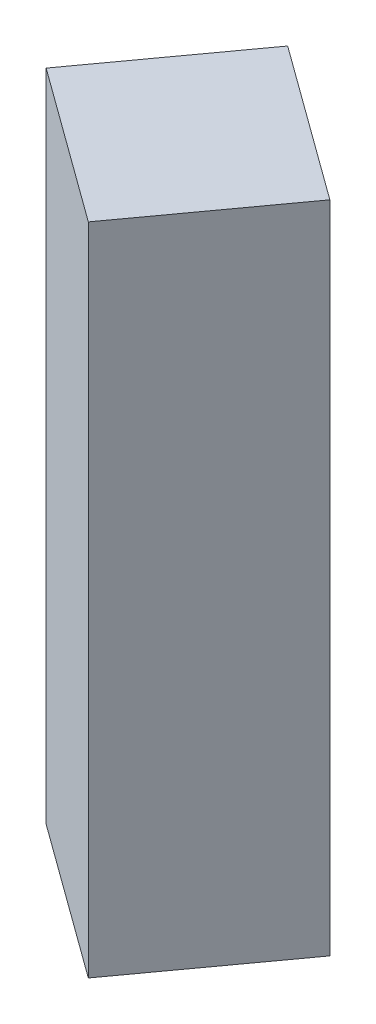
ISO-10303-21;
HEADER;
FILE_DESCRIPTION(('STEP AP214'),'2;1');
FILE_NAME('part.step','',(''),(''),'','','');
FILE_SCHEMA(('AUTOMOTIVE_DESIGN { 1 0 10303 214 1 1 1 1 }'));
ENDSEC;
DATA;
#1=APPLICATION_CONTEXT('core data for automotive mechanical design processes');
#2=APPLICATION_PROTOCOL_DEFINITION('international standard','automotive_design',2000,#1);
#3=PRODUCT_CONTEXT('',#1,'mechanical');
#4=PRODUCT('Part','Part','',(#3));
#5=PRODUCT_RELATED_PRODUCT_CATEGORY('part','',(#4));
#6=PRODUCT_DEFINITION_FORMATION('','',#4);
#7=PRODUCT_DEFINITION_CONTEXT('part definition',#1,'design');
#8=PRODUCT_DEFINITION('design','',#6,#7);
#9=PRODUCT_DEFINITION_SHAPE('','',#8);
#10=(LENGTH_UNIT() NAMED_UNIT(*) SI_UNIT(.MILLI.,.METRE.));
#11=(NAMED_UNIT(*) PLANE_ANGLE_UNIT() SI_UNIT($,.RADIAN.));
#12=(NAMED_UNIT(*) SI_UNIT($,.STERADIAN.) SOLID_ANGLE_UNIT());
#13=UNCERTAINTY_MEASURE_WITH_UNIT(LENGTH_MEASURE(1.E-05),#10,'distance_accuracy_value','');
#14=(GEOMETRIC_REPRESENTATION_CONTEXT(3) GLOBAL_UNCERTAINTY_ASSIGNED_CONTEXT((#13)) GLOBAL_UNIT_ASSIGNED_CONTEXT((#10,
#11,#12)) REPRESENTATION_CONTEXT('',''));
#15=CARTESIAN_POINT('',(0.,0.,0.));
#16=DIRECTION('',(0.,0.,1.));
#17=DIRECTION('',(1.,0.,0.));
#18=AXIS2_PLACEMENT_3D('',#15,#16,#17);
#19=CARTESIAN_POINT('',(97.2404196158,41.8789091554,79.586125689));
#20=DIRECTION('',(0.809016988906328,0.,0.587785259819381));
#21=DIRECTION('',(0.587785259819381,0.,-0.809016988906328));
#22=AXIS2_PLACEMENT_3D('',#19,#20,#21);
#23=PLANE('',#22);
#24=DIRECTION('',(-0.587785259819381,0.,0.809016988906329));
#25=VECTOR('',#24,1.);
#26=CARTESIAN_POINT('',(97.6255914896,46.8419278552,79.055982096));
#27=LINE('',#26,#25);
#28=CARTESIAN_POINT('',(98.0107633634,46.8419278552,78.525838503));
#29=VERTEX_POINT('',#28);
#30=CARTESIAN_POINT('',(97.2404196158,46.8419278552,79.586125689));
#31=VERTEX_POINT('',#30);
#32=EDGE_CURVE('E61',#29,#31,#27,.T.);
#33=ORIENTED_EDGE('',*,*,#32,.T.);
#34=DIRECTION('',(0.,1.,0.));
#35=VECTOR('',#34,1.);
#36=CARTESIAN_POINT('',(97.2404196158,44.3604185053,79.586125689));
#37=LINE('',#36,#35);
#38=CARTESIAN_POINT('',(97.2404196232103,41.8789091554,79.5861256991877));
#39=VERTEX_POINT('',#38);
#40=EDGE_CURVE('E81',#39,#31,#37,.T.);
#41=ORIENTED_EDGE('',*,*,#40,.F.);
#42=DIRECTION('',(0.587785259819381,0.,-0.809016988906329));
#43=VECTOR('',#42,1.);
#44=CARTESIAN_POINT('',(97.6255914896,41.8789091554,79.055982096));
#45=LINE('',#44,#43);
#46=CARTESIAN_POINT('',(98.0107633642956,41.8789091554,78.5258385069229));
#47=VERTEX_POINT('',#46);
#48=EDGE_CURVE('E84',#39,#47,#45,.T.);
#49=ORIENTED_EDGE('',*,*,#48,.T.);
#50=DIRECTION('',(0.,-1.,0.));
#51=VECTOR('',#50,1.);
#52=CARTESIAN_POINT('',(98.0107633634,44.3604185053,78.525838503));
#53=LINE('',#52,#51);
#54=EDGE_CURVE('E65',#29,#47,#53,.T.);
#55=ORIENTED_EDGE('',*,*,#54,.F.);
#56=EDGE_LOOP('',(#33,#41,#49,#55));
#57=FACE_BOUND('',#56,.T.);
#58=ADVANCED_FACE('F17',(#57),#23,.T.);
#59=CARTESIAN_POINT('',(96.0710590132,41.8789091554,78.7365354908));
#60=DIRECTION('',(-0.587785247690543,0.,0.809016997718445));
#61=DIRECTION('',(0.809016997718445,0.,0.587785247690543));
#62=AXIS2_PLACEMENT_3D('',#59,#60,#61);
#63=PLANE('',#62);
#64=DIRECTION('',(-0.809016997718445,0.,-0.587785247690543));
#65=VECTOR('',#64,1.);
#66=CARTESIAN_POINT('',(96.6557393145,46.8419278552,79.1613305899));
#67=LINE('',#66,#65);
#68=CARTESIAN_POINT('',(96.0710590132,46.8419278552,78.7365354908));
#69=VERTEX_POINT('',#68);
#70=EDGE_CURVE('E78',#31,#69,#67,.T.);
#71=ORIENTED_EDGE('',*,*,#70,.T.);
#72=DIRECTION('',(0.,1.,0.));
#73=VECTOR('',#72,1.);
#74=CARTESIAN_POINT('',(96.0710590132,44.3604185053,78.7365354908));
#75=LINE('',#74,#73);
#76=CARTESIAN_POINT('',(96.0710590103535,41.8789091554,78.7365354887319));
#77=VERTEX_POINT('',#76);
#78=EDGE_CURVE('E73',#77,#69,#75,.T.);
#79=ORIENTED_EDGE('',*,*,#78,.F.);
#80=DIRECTION('',(0.809016997718445,0.,0.587785247690543));
#81=VECTOR('',#80,1.);
#82=CARTESIAN_POINT('',(96.6557393145,41.8789091554,79.1613305899));
#83=LINE('',#82,#81);
#84=EDGE_CURVE('E31',#77,#39,#83,.T.);
#85=ORIENTED_EDGE('',*,*,#84,.T.);
#86=ORIENTED_EDGE('',*,*,#40,.T.);
#87=EDGE_LOOP('',(#71,#79,#85,#86));
#88=FACE_BOUND('',#87,.T.);
#89=ADVANCED_FACE('F89',(#88),#63,.T.);
#90=CARTESIAN_POINT('',(98.0107633634,46.8419278552,78.525838503));
#91=DIRECTION('',(0.,-1.,0.));
#92=DIRECTION('',(-0.587785259819381,0.,0.809016988906328));
#93=AXIS2_PLACEMENT_3D('',#90,#91,#92);
#94=PLANE('',#93);
#95=ORIENTED_EDGE('',*,*,#32,.F.);
#96=DIRECTION('',(0.809016995433336,0.,0.587785250835726));
#97=VECTOR('',#96,1.);
#98=CARTESIAN_POINT('',(97.4260830494,46.8419278552,78.1010433912));
#99=LINE('',#98,#97);
#100=CARTESIAN_POINT('',(96.8414027354,46.8419278552,77.6762482794));
#101=VERTEX_POINT('',#100);
#102=EDGE_CURVE('E54',#101,#29,#99,.T.);
#103=ORIENTED_EDGE('',*,*,#102,.F.);
#104=DIRECTION('',(0.587785237918549,0.,-0.809017004818214));
#105=VECTOR('',#104,1.);
#106=CARTESIAN_POINT('',(96.4562308743,46.8419278552,78.2063918851));
#107=LINE('',#106,#105);
#108=EDGE_CURVE('E59',#69,#101,#107,.T.);
#109=ORIENTED_EDGE('',*,*,#108,.F.);
#110=ORIENTED_EDGE('',*,*,#70,.F.);
#111=EDGE_LOOP('',(#95,#103,#109,#110));
#112=FACE_BOUND('',#111,.T.);
#113=ADVANCED_FACE('F56',(#112),#94,.F.);
#114=CARTESIAN_POINT('',(98.0107633634,41.8789091554,78.525838503));
#115=DIRECTION('',(0.587785250835726,0.,-0.809016995433336));
#116=DIRECTION('',(-0.809016995433336,0.,-0.587785250835726));
#117=AXIS2_PLACEMENT_3D('',#114,#115,#116);
#118=PLANE('',#117);
#119=ORIENTED_EDGE('',*,*,#102,.T.);
#120=ORIENTED_EDGE('',*,*,#54,.T.);
#121=DIRECTION('',(-0.809016995433336,0.,-0.587785250835726));
#122=VECTOR('',#121,1.);
#123=CARTESIAN_POINT('',(97.4260830494,41.8789091554,78.1010433912));
#124=LINE('',#123,#122);
#125=CARTESIAN_POINT('',(96.8414027400568,41.8789091554,77.6762482827834));
#126=VERTEX_POINT('',#125);
#127=EDGE_CURVE('E66',#47,#126,#124,.T.);
#128=ORIENTED_EDGE('',*,*,#127,.T.);
#129=DIRECTION('',(0.,-1.,0.));
#130=VECTOR('',#129,1.);
#131=CARTESIAN_POINT('',(96.8414027354,44.3604185053,77.6762482794));
#132=LINE('',#131,#130);
#133=EDGE_CURVE('E26',#101,#126,#132,.T.);
#134=ORIENTED_EDGE('',*,*,#133,.F.);
#135=EDGE_LOOP('',(#119,#120,#128,#134));
#136=FACE_BOUND('',#135,.T.);
#137=ADVANCED_FACE('F69',(#136),#118,.T.);
#138=CARTESIAN_POINT('',(96.8414027354,41.8789091554,77.6762482794));
#139=DIRECTION('',(-0.809017004818214,0.,-0.587785237918549));
#140=DIRECTION('',(-0.587785237918549,0.,0.809017004818214));
#141=AXIS2_PLACEMENT_3D('',#138,#139,#140);
#142=PLANE('',#141);
#143=ORIENTED_EDGE('',*,*,#108,.T.);
#144=ORIENTED_EDGE('',*,*,#133,.T.);
#145=DIRECTION('',(0.587785249368989,0.,-0.809016996498983));
#146=VECTOR('',#145,1.);
#147=CARTESIAN_POINT('',(96.071059010619,41.8789091554,78.7365354823803));
#148=LINE('',#147,#146);
#149=EDGE_CURVE('E11',#77,#126,#148,.T.);
#150=ORIENTED_EDGE('',*,*,#149,.F.);
#151=ORIENTED_EDGE('',*,*,#78,.T.);
#152=EDGE_LOOP('',(#143,#144,#150,#151));
#153=FACE_BOUND('',#152,.T.);
#154=ADVANCED_FACE('F72',(#153),#142,.T.);
#155=CARTESIAN_POINT('',(96.059420784,41.8789091554,79.5975849752));
#156=DIRECTION('',(0.,-1.,0.));
#157=DIRECTION('',(0.,0.,-1.));
#158=AXIS2_PLACEMENT_3D('',#155,#156,#157);
#159=PLANE('',#158);
#160=ORIENTED_EDGE('',*,*,#84,.F.);
#161=ORIENTED_EDGE('',*,*,#149,.T.);
#162=ORIENTED_EDGE('',*,*,#127,.F.);
#163=ORIENTED_EDGE('',*,*,#48,.F.);
#164=EDGE_LOOP('',(#160,#161,#162,#163));
#165=FACE_BOUND('',#164,.T.);
#166=ADVANCED_FACE('F19',(#165),#159,.T.);
#167=CLOSED_SHELL('',(#58,#89,#113,#137,#154,#166));
#168=MANIFOLD_SOLID_BREP('B1',#167);
#169=ADVANCED_BREP_SHAPE_REPRESENTATION('',(#18,#168),#14);
#170=SHAPE_DEFINITION_REPRESENTATION(#9,#169);
ENDSEC;
END-ISO-10303-21;
